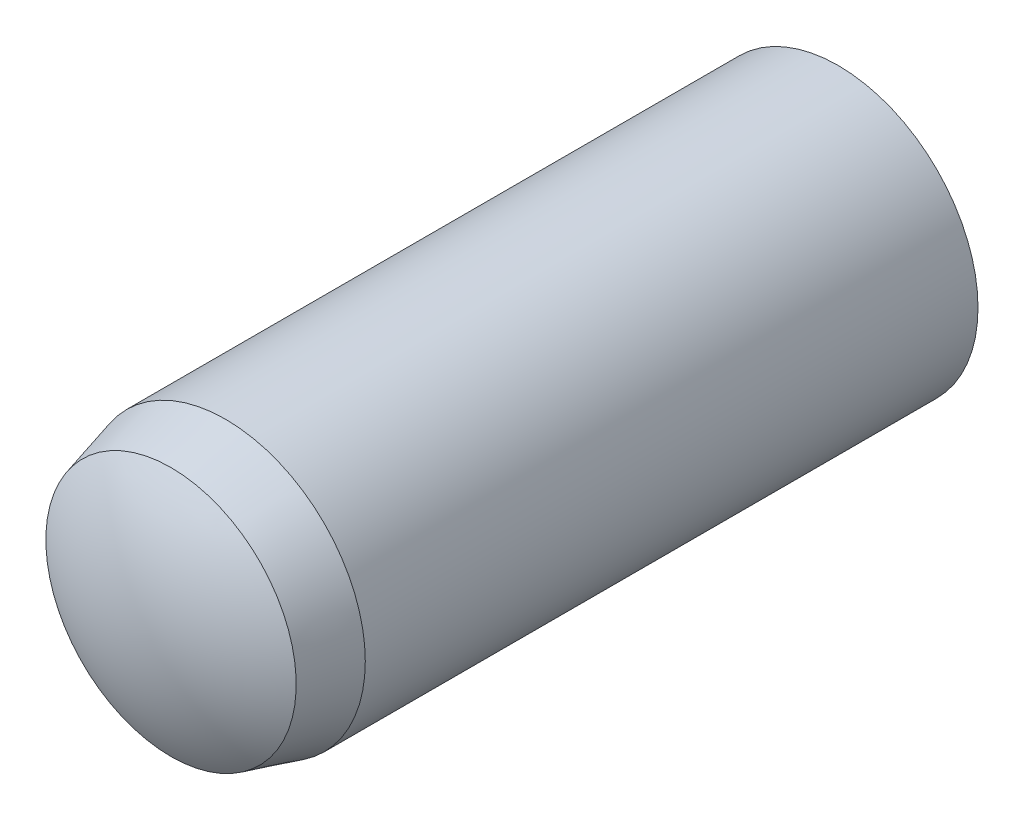
ISO-10303-21;
HEADER;
FILE_DESCRIPTION(('STEP AP214'),'2;1');
FILE_NAME('part.step','',(''),(''),'','','');
FILE_SCHEMA(('AUTOMOTIVE_DESIGN { 1 0 10303 214 1 1 1 1 }'));
ENDSEC;
DATA;
#1=APPLICATION_CONTEXT('core data for automotive mechanical design processes');
#2=APPLICATION_PROTOCOL_DEFINITION('international standard','automotive_design',2000,#1);
#3=PRODUCT_CONTEXT('',#1,'mechanical');
#4=PRODUCT('Part','Part','',(#3));
#5=PRODUCT_RELATED_PRODUCT_CATEGORY('part','',(#4));
#6=PRODUCT_DEFINITION_FORMATION('','',#4);
#7=PRODUCT_DEFINITION_CONTEXT('part definition',#1,'design');
#8=PRODUCT_DEFINITION('design','',#6,#7);
#9=PRODUCT_DEFINITION_SHAPE('','',#8);
#10=(LENGTH_UNIT() NAMED_UNIT(*) SI_UNIT(.MILLI.,.METRE.));
#11=(NAMED_UNIT(*) PLANE_ANGLE_UNIT() SI_UNIT($,.RADIAN.));
#12=(NAMED_UNIT(*) SI_UNIT($,.STERADIAN.) SOLID_ANGLE_UNIT());
#13=UNCERTAINTY_MEASURE_WITH_UNIT(LENGTH_MEASURE(1.E-05),#10,'distance_accuracy_value','');
#14=(GEOMETRIC_REPRESENTATION_CONTEXT(3) GLOBAL_UNCERTAINTY_ASSIGNED_CONTEXT((#13)) GLOBAL_UNIT_ASSIGNED_CONTEXT((#10,
#11,#12)) REPRESENTATION_CONTEXT('',''));
#15=CARTESIAN_POINT('',(0.,0.,0.));
#16=DIRECTION('',(0.,0.,1.));
#17=DIRECTION('',(1.,0.,0.));
#18=AXIS2_PLACEMENT_3D('',#15,#16,#17);
#19=CARTESIAN_POINT('',(0.,0.,-1.275));
#20=DIRECTION('',(0.,0.,1.));
#21=DIRECTION('',(0.,1.,0.));
#22=AXIS2_PLACEMENT_3D('',#19,#20,#21);
#23=SPHERICAL_SURFACE('',#22,2.725);
#24=CARTESIAN_POINT('',(0.,0.,-3.55));
#25=DIRECTION('',(0.,0.,1.));
#26=DIRECTION('',(0.,-1.,0.));
#27=AXIS2_PLACEMENT_3D('',#24,#25,#26);
#28=CIRCLE('',#27,1.5);
#29=CARTESIAN_POINT('',(0.,-1.5,-3.55));
#30=VERTEX_POINT('',#29);
#31=EDGE_CURVE('E10',#30,#30,#28,.T.);
#32=ORIENTED_EDGE('',*,*,#31,.F.);
#33=EDGE_LOOP('',(#32));
#34=FACE_BOUND('',#33,.T.);
#35=ADVANCED_FACE('F37',(#34),#23,.T.);
#36=CARTESIAN_POINT('',(0.,0.,4.));
#37=DIRECTION('',(0.,0.,1.));
#38=DIRECTION('',(0.,-1.,0.));
#39=AXIS2_PLACEMENT_3D('',#36,#37,#38);
#40=CYLINDRICAL_SURFACE('',#39,1.5);
#41=CARTESIAN_POINT('',(0.,0.,3.025));
#42=DIRECTION('',(0.,0.,1.));
#43=DIRECTION('',(0.,-1.,0.));
#44=AXIS2_PLACEMENT_3D('',#41,#42,#43);
#45=CIRCLE('',#44,1.5);
#46=CARTESIAN_POINT('',(0.,-1.5,3.025));
#47=VERTEX_POINT('',#46);
#48=EDGE_CURVE('E43',#47,#47,#45,.T.);
#49=ORIENTED_EDGE('',*,*,#48,.F.);
#50=EDGE_LOOP('',(#49));
#51=FACE_BOUND('',#50,.T.);
#52=ORIENTED_EDGE('',*,*,#31,.T.);
#53=EDGE_LOOP('',(#52));
#54=FACE_BOUND('',#53,.T.);
#55=ADVANCED_FACE('F58',(#51,#54),#40,.T.);
#56=CARTESIAN_POINT('',(0.,0.,3.025));
#57=DIRECTION('',(0.,0.,-1.));
#58=DIRECTION('',(0.,1.,0.));
#59=AXIS2_PLACEMENT_3D('',#56,#57,#58);
#60=CONICAL_SURFACE('',#59,1.5,0.261799387799151);
#61=CARTESIAN_POINT('',(0.,0.,3.61));
#62=DIRECTION('',(0.,0.,1.));
#63=DIRECTION('',(0.,-1.,0.));
#64=AXIS2_PLACEMENT_3D('',#61,#62,#63);
#65=CIRCLE('',#64,1.34324972242779);
#66=CARTESIAN_POINT('',(0.,-1.34324972242779,3.61));
#67=VERTEX_POINT('',#66);
#68=EDGE_CURVE('E47',#67,#67,#65,.T.);
#69=ORIENTED_EDGE('',*,*,#68,.F.);
#70=EDGE_LOOP('',(#69));
#71=FACE_BOUND('',#70,.T.);
#72=ORIENTED_EDGE('',*,*,#48,.T.);
#73=EDGE_LOOP('',(#72));
#74=FACE_BOUND('',#73,.T.);
#75=ADVANCED_FACE('F56',(#71,#74),#60,.T.);
#76=CARTESIAN_POINT('',(0.,0.,1.49176946563802));
#77=DIRECTION('',(0.,0.,1.));
#78=DIRECTION('',(0.,1.,0.));
#79=AXIS2_PLACEMENT_3D('',#76,#77,#78);
#80=SPHERICAL_SURFACE('',#79,2.50823053436198);
#81=ORIENTED_EDGE('',*,*,#68,.T.);
#82=EDGE_LOOP('',(#81));
#83=FACE_BOUND('',#82,.T.);
#84=ADVANCED_FACE('F54',(#83),#80,.T.);
#85=CLOSED_SHELL('',(#35,#55,#75,#84));
#86=MANIFOLD_SOLID_BREP('B2',#85);
#87=ADVANCED_BREP_SHAPE_REPRESENTATION('',(#18,#86),#14);
#88=SHAPE_DEFINITION_REPRESENTATION(#9,#87);
ENDSEC;
END-ISO-10303-21;
